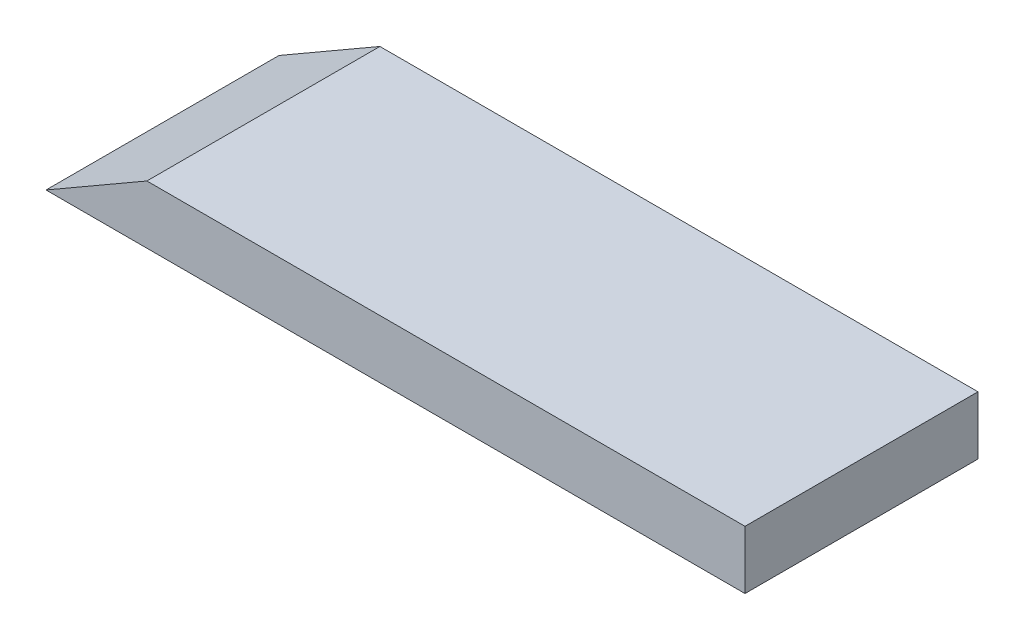
ISO-10303-21;
HEADER;
FILE_DESCRIPTION(('STEP AP214'),'2;1');
FILE_NAME('part.step','',(''),(''),'','','');
FILE_SCHEMA(('AUTOMOTIVE_DESIGN { 1 0 10303 214 1 1 1 1 }'));
ENDSEC;
DATA;
#1=APPLICATION_CONTEXT('core data for automotive mechanical design processes');
#2=APPLICATION_PROTOCOL_DEFINITION('international standard','automotive_design',2000,#1);
#3=PRODUCT_CONTEXT('',#1,'mechanical');
#4=PRODUCT('Part','Part','',(#3));
#5=PRODUCT_RELATED_PRODUCT_CATEGORY('part','',(#4));
#6=PRODUCT_DEFINITION_FORMATION('','',#4);
#7=PRODUCT_DEFINITION_CONTEXT('part definition',#1,'design');
#8=PRODUCT_DEFINITION('design','',#6,#7);
#9=PRODUCT_DEFINITION_SHAPE('','',#8);
#10=(LENGTH_UNIT() NAMED_UNIT(*) SI_UNIT(.MILLI.,.METRE.));
#11=(NAMED_UNIT(*) PLANE_ANGLE_UNIT() SI_UNIT($,.RADIAN.));
#12=(NAMED_UNIT(*) SI_UNIT($,.STERADIAN.) SOLID_ANGLE_UNIT());
#13=UNCERTAINTY_MEASURE_WITH_UNIT(LENGTH_MEASURE(1.E-05),#10,'distance_accuracy_value','');
#14=(GEOMETRIC_REPRESENTATION_CONTEXT(3) GLOBAL_UNCERTAINTY_ASSIGNED_CONTEXT((#13)) GLOBAL_UNIT_ASSIGNED_CONTEXT((#10,
#11,#12)) REPRESENTATION_CONTEXT('',''));
#15=CARTESIAN_POINT('',(0.,0.,0.));
#16=DIRECTION('',(0.,0.,1.));
#17=DIRECTION('',(1.,0.,0.));
#18=AXIS2_PLACEMENT_3D('',#15,#16,#17);
#19=CARTESIAN_POINT('',(-38.1,3.175,-12.7));
#20=DIRECTION('',(0.,0.,-1.));
#21=DIRECTION('',(-1.,0.,0.));
#22=AXIS2_PLACEMENT_3D('',#19,#20,#21);
#23=PLANE('',#22);
#24=DIRECTION('',(1.,0.,0.));
#25=VECTOR('',#24,1.);
#26=CARTESIAN_POINT('',(-38.1,-3.175,-12.7));
#27=LINE('',#26,#25);
#28=CARTESIAN_POINT('',(-38.1,-3.175,-12.7));
#29=VERTEX_POINT('',#28);
#30=CARTESIAN_POINT('',(38.1,-3.175,-12.7));
#31=VERTEX_POINT('',#30);
#32=EDGE_CURVE('E104',#29,#31,#27,.T.);
#33=ORIENTED_EDGE('',*,*,#32,.F.);
#34=DIRECTION('',(-0.866025403784438,-0.500000000000001,0.));
#35=VECTOR('',#34,1.);
#36=CARTESIAN_POINT('',(-35.3503693429844,-1.5875,-12.7));
#37=LINE('',#36,#35);
#38=CARTESIAN_POINT('',(-27.1014773719376,3.175,-12.7));
#39=VERTEX_POINT('',#38);
#40=EDGE_CURVE('E60',#29,#39,#37,.F.);
#41=ORIENTED_EDGE('',*,*,#40,.T.);
#42=DIRECTION('',(1.,0.,0.));
#43=VECTOR('',#42,1.);
#44=CARTESIAN_POINT('',(-38.1,3.175,-12.7));
#45=LINE('',#44,#43);
#46=CARTESIAN_POINT('',(38.1,3.175,-12.7));
#47=VERTEX_POINT('',#46);
#48=EDGE_CURVE('E74',#39,#47,#45,.T.);
#49=ORIENTED_EDGE('',*,*,#48,.T.);
#50=DIRECTION('',(0.,-1.,0.));
#51=VECTOR('',#50,1.);
#52=CARTESIAN_POINT('',(38.1,3.175,-12.7));
#53=LINE('',#52,#51);
#54=EDGE_CURVE('E77',#47,#31,#53,.T.);
#55=ORIENTED_EDGE('',*,*,#54,.T.);
#56=EDGE_LOOP('',(#33,#41,#49,#55));
#57=FACE_BOUND('',#56,.T.);
#58=ADVANCED_FACE('F38',(#57),#23,.T.);
#59=CARTESIAN_POINT('',(-38.1,3.175,12.7));
#60=DIRECTION('',(0.,0.,-1.));
#61=DIRECTION('',(-1.,0.,0.));
#62=AXIS2_PLACEMENT_3D('',#59,#60,#61);
#63=PLANE('',#62);
#64=DIRECTION('',(1.,0.,0.));
#65=VECTOR('',#64,1.);
#66=CARTESIAN_POINT('',(-38.1,3.175,12.7));
#67=LINE('',#66,#65);
#68=CARTESIAN_POINT('',(-27.1014773719376,3.175,12.7));
#69=VERTEX_POINT('',#68);
#70=CARTESIAN_POINT('',(38.1,3.175,12.7));
#71=VERTEX_POINT('',#70);
#72=EDGE_CURVE('E84',#69,#71,#67,.T.);
#73=ORIENTED_EDGE('',*,*,#72,.F.);
#74=DIRECTION('',(0.866025403784438,0.500000000000001,0.));
#75=VECTOR('',#74,1.);
#76=CARTESIAN_POINT('',(-38.1,-3.17500000000001,12.7));
#77=LINE('',#76,#75);
#78=CARTESIAN_POINT('',(-38.1,-3.175,12.7));
#79=VERTEX_POINT('',#78);
#80=EDGE_CURVE('E11',#69,#79,#77,.F.);
#81=ORIENTED_EDGE('',*,*,#80,.T.);
#82=DIRECTION('',(1.,0.,0.));
#83=VECTOR('',#82,1.);
#84=CARTESIAN_POINT('',(-38.1,-3.175,12.7));
#85=LINE('',#84,#83);
#86=CARTESIAN_POINT('',(38.1,-3.175,12.7));
#87=VERTEX_POINT('',#86);
#88=EDGE_CURVE('E101',#79,#87,#85,.T.);
#89=ORIENTED_EDGE('',*,*,#88,.T.);
#90=DIRECTION('',(0.,-1.,0.));
#91=VECTOR('',#90,1.);
#92=CARTESIAN_POINT('',(38.1,3.175,12.7));
#93=LINE('',#92,#91);
#94=EDGE_CURVE('E93',#71,#87,#93,.T.);
#95=ORIENTED_EDGE('',*,*,#94,.F.);
#96=EDGE_LOOP('',(#73,#81,#89,#95));
#97=FACE_BOUND('',#96,.T.);
#98=ADVANCED_FACE('F112',(#97),#63,.F.);
#99=CARTESIAN_POINT('',(38.1,3.175,12.7));
#100=DIRECTION('',(-1.,0.,0.));
#101=DIRECTION('',(0.,0.,1.));
#102=AXIS2_PLACEMENT_3D('',#99,#100,#101);
#103=PLANE('',#102);
#104=DIRECTION('',(0.,0.,-1.));
#105=VECTOR('',#104,1.);
#106=CARTESIAN_POINT('',(38.1,-3.175,12.7));
#107=LINE('',#106,#105);
#108=EDGE_CURVE('E91',#87,#31,#107,.T.);
#109=ORIENTED_EDGE('',*,*,#108,.T.);
#110=ORIENTED_EDGE('',*,*,#54,.F.);
#111=DIRECTION('',(0.,0.,-1.));
#112=VECTOR('',#111,1.);
#113=CARTESIAN_POINT('',(38.1,3.175,12.7));
#114=LINE('',#113,#112);
#115=EDGE_CURVE('E79',#71,#47,#114,.T.);
#116=ORIENTED_EDGE('',*,*,#115,.F.);
#117=ORIENTED_EDGE('',*,*,#94,.T.);
#118=EDGE_LOOP('',(#109,#110,#116,#117));
#119=FACE_BOUND('',#118,.T.);
#120=ADVANCED_FACE('F89',(#119),#103,.F.);
#121=CARTESIAN_POINT('',(0.,3.175,0.));
#122=DIRECTION('',(0.,1.,0.));
#123=DIRECTION('',(0.,0.,1.));
#124=AXIS2_PLACEMENT_3D('',#121,#122,#123);
#125=PLANE('',#124);
#126=ORIENTED_EDGE('',*,*,#48,.F.);
#127=DIRECTION('',(0.,0.,1.));
#128=VECTOR('',#127,1.);
#129=CARTESIAN_POINT('',(-27.1014773719376,3.175,0.));
#130=LINE('',#129,#128);
#131=EDGE_CURVE('E46',#39,#69,#130,.T.);
#132=ORIENTED_EDGE('',*,*,#131,.T.);
#133=ORIENTED_EDGE('',*,*,#72,.T.);
#134=ORIENTED_EDGE('',*,*,#115,.T.);
#135=EDGE_LOOP('',(#126,#132,#133,#134));
#136=FACE_BOUND('',#135,.T.);
#137=ADVANCED_FACE('F83',(#136),#125,.T.);
#138=CARTESIAN_POINT('',(0.,-3.175,0.));
#139=DIRECTION('',(0.,1.,0.));
#140=DIRECTION('',(0.,0.,1.));
#141=AXIS2_PLACEMENT_3D('',#138,#139,#140);
#142=PLANE('',#141);
#143=ORIENTED_EDGE('',*,*,#32,.T.);
#144=ORIENTED_EDGE('',*,*,#108,.F.);
#145=ORIENTED_EDGE('',*,*,#88,.F.);
#146=DIRECTION('',(0.,0.,-1.));
#147=VECTOR('',#146,1.);
#148=CARTESIAN_POINT('',(-38.1,-3.175,12.7));
#149=LINE('',#148,#147);
#150=EDGE_CURVE('E80',#79,#29,#149,.T.);
#151=ORIENTED_EDGE('',*,*,#150,.T.);
#152=EDGE_LOOP('',(#143,#144,#145,#151));
#153=FACE_BOUND('',#152,.T.);
#154=ADVANCED_FACE('F106',(#153),#142,.F.);
#155=CARTESIAN_POINT('',(-38.1,-3.17500000000001,12.7));
#156=DIRECTION('',(0.500000000000001,-0.866025403784438,0.));
#157=DIRECTION('',(0.,0.,-1.));
#158=AXIS2_PLACEMENT_3D('',#155,#156,#157);
#159=PLANE('',#158);
#160=ORIENTED_EDGE('',*,*,#80,.F.);
#161=ORIENTED_EDGE('',*,*,#131,.F.);
#162=ORIENTED_EDGE('',*,*,#40,.F.);
#163=ORIENTED_EDGE('',*,*,#150,.F.);
#164=EDGE_LOOP('',(#160,#161,#162,#163));
#165=FACE_BOUND('',#164,.T.);
#166=ADVANCED_FACE('F40',(#165),#159,.F.);
#167=CLOSED_SHELL('',(#58,#98,#120,#137,#154,#166));
#168=MANIFOLD_SOLID_BREP('B2',#167);
#169=ADVANCED_BREP_SHAPE_REPRESENTATION('',(#18,#168),#14);
#170=SHAPE_DEFINITION_REPRESENTATION(#9,#169);
ENDSEC;
END-ISO-10303-21;
